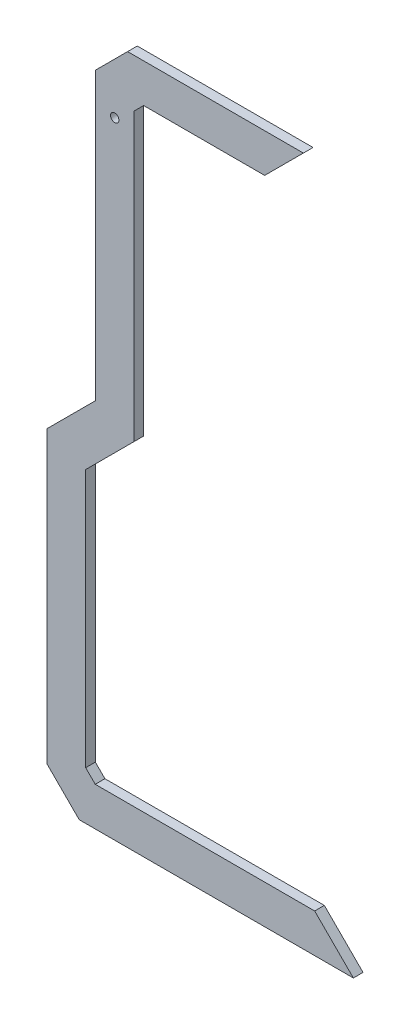
ISO-10303-21;
HEADER;
FILE_DESCRIPTION(('STEP AP214'),'2;1');
FILE_NAME('part.step','',(''),(''),'','','');
FILE_SCHEMA(('AUTOMOTIVE_DESIGN { 1 0 10303 214 1 1 1 1 }'));
ENDSEC;
DATA;
#1=APPLICATION_CONTEXT('core data for automotive mechanical design processes');
#2=APPLICATION_PROTOCOL_DEFINITION('international standard','automotive_design',2000,#1);
#3=PRODUCT_CONTEXT('',#1,'mechanical');
#4=PRODUCT('Part','Part','',(#3));
#5=PRODUCT_RELATED_PRODUCT_CATEGORY('part','',(#4));
#6=PRODUCT_DEFINITION_FORMATION('','',#4);
#7=PRODUCT_DEFINITION_CONTEXT('part definition',#1,'design');
#8=PRODUCT_DEFINITION('design','',#6,#7);
#9=PRODUCT_DEFINITION_SHAPE('','',#8);
#10=(LENGTH_UNIT() NAMED_UNIT(*) SI_UNIT(.MILLI.,.METRE.));
#11=(NAMED_UNIT(*) PLANE_ANGLE_UNIT() SI_UNIT($,.RADIAN.));
#12=(NAMED_UNIT(*) SI_UNIT($,.STERADIAN.) SOLID_ANGLE_UNIT());
#13=UNCERTAINTY_MEASURE_WITH_UNIT(LENGTH_MEASURE(1.E-05),#10,'distance_accuracy_value','');
#14=(GEOMETRIC_REPRESENTATION_CONTEXT(3) GLOBAL_UNCERTAINTY_ASSIGNED_CONTEXT((#13)) GLOBAL_UNIT_ASSIGNED_CONTEXT((#10,
#11,#12)) REPRESENTATION_CONTEXT('',''));
#15=CARTESIAN_POINT('',(0.,0.,0.));
#16=DIRECTION('',(0.,0.,1.));
#17=DIRECTION('',(1.,0.,0.));
#18=AXIS2_PLACEMENT_3D('',#15,#16,#17);
#19=CARTESIAN_POINT('',(0.,0.,3.));
#20=DIRECTION('',(0.,0.,1.));
#21=DIRECTION('',(1.,0.,0.));
#22=AXIS2_PLACEMENT_3D('',#19,#20,#21);
#23=PLANE('',#22);
#24=DIRECTION('',(-0.707106781186551,0.707106781186544,0.));
#25=VECTOR('',#24,1.);
#26=CARTESIAN_POINT('',(58.0000000000498,-167.75395984717,3.));
#27=LINE('',#26,#25);
#28=CARTESIAN_POINT('',(70.00000000005,-179.75395984717,3.));
#29=VERTEX_POINT('',#28);
#30=CARTESIAN_POINT('',(58.0000000000498,-167.75395984717,3.));
#31=VERTEX_POINT('',#30);
#32=EDGE_CURVE('E221',#29,#31,#27,.T.);
#33=ORIENTED_EDGE('',*,*,#32,.T.);
#34=DIRECTION('',(-1.,0.,0.));
#35=VECTOR('',#34,1.);
#36=CARTESIAN_POINT('',(-10.0294372514729,-167.75395984717,3.));
#37=LINE('',#36,#35);
#38=CARTESIAN_POINT('',(-10.0294372514729,-167.75395984717,3.));
#39=VERTEX_POINT('',#38);
#40=EDGE_CURVE('E129',#31,#39,#37,.T.);
#41=ORIENTED_EDGE('',*,*,#40,.T.);
#42=DIRECTION('',(-0.707106781186547,0.707106781186548,0.));
#43=VECTOR('',#42,1.);
#44=CARTESIAN_POINT('',(-12.9999999999501,-164.783397098693,3.));
#45=LINE('',#44,#43);
#46=CARTESIAN_POINT('',(-12.9999999999501,-164.783397098693,3.));
#47=VERTEX_POINT('',#46);
#48=EDGE_CURVE('E260',#39,#47,#45,.T.);
#49=ORIENTED_EDGE('',*,*,#48,.T.);
#50=DIRECTION('',(0.,1.,0.));
#51=VECTOR('',#50,1.);
#52=CARTESIAN_POINT('',(-12.9999999999501,-84.724522595647,3.));
#53=LINE('',#52,#51);
#54=CARTESIAN_POINT('',(-12.9999999999501,-84.724522595647,3.));
#55=VERTEX_POINT('',#54);
#56=EDGE_CURVE('E279',#47,#55,#53,.T.);
#57=ORIENTED_EDGE('',*,*,#56,.T.);
#58=DIRECTION('',(0.707106781186548,0.707106781186547,0.));
#59=VECTOR('',#58,1.);
#60=CARTESIAN_POINT('',(2.00000000004993,-69.724522595647,3.));
#61=LINE('',#60,#59);
#62=CARTESIAN_POINT('',(2.00000000004993,-69.724522595647,3.));
#63=VERTEX_POINT('',#62);
#64=EDGE_CURVE('E276',#55,#63,#61,.T.);
#65=ORIENTED_EDGE('',*,*,#64,.T.);
#66=DIRECTION('',(0.,1.,0.));
#67=VECTOR('',#66,1.);
#68=CARTESIAN_POINT('',(2.0000000000499,19.0329830325361,3.));
#69=LINE('',#68,#67);
#70=CARTESIAN_POINT('',(2.0000000000499,19.0329830325361,3.));
#71=VERTEX_POINT('',#70);
#72=EDGE_CURVE('E278',#63,#71,#69,.T.);
#73=ORIENTED_EDGE('',*,*,#72,.T.);
#74=DIRECTION('',(0.707106781186547,0.707106781186548,0.));
#75=VECTOR('',#74,1.);
#76=CARTESIAN_POINT('',(4.97056274852707,22.0035457810133,3.));
#77=LINE('',#76,#75);
#78=CARTESIAN_POINT('',(4.97056274852707,22.0035457810133,3.));
#79=VERTEX_POINT('',#78);
#80=EDGE_CURVE('E281',#71,#79,#77,.T.);
#81=ORIENTED_EDGE('',*,*,#80,.T.);
#82=DIRECTION('',(1.,0.,0.));
#83=VECTOR('',#82,1.);
#84=CARTESIAN_POINT('',(42.5000000000001,22.0035457810132,3.));
#85=LINE('',#84,#83);
#86=CARTESIAN_POINT('',(42.5000000000001,22.0035457810132,3.));
#87=VERTEX_POINT('',#86);
#88=EDGE_CURVE('E287',#79,#87,#85,.T.);
#89=ORIENTED_EDGE('',*,*,#88,.T.);
#90=DIRECTION('',(0.707106781186546,0.707106781186549,0.));
#91=VECTOR('',#90,1.);
#92=CARTESIAN_POINT('',(54.5000000000001,34.0035457810133,3.));
#93=LINE('',#92,#91);
#94=CARTESIAN_POINT('',(54.5000000000001,34.0035457810133,3.));
#95=VERTEX_POINT('',#94);
#96=EDGE_CURVE('E289',#87,#95,#93,.T.);
#97=ORIENTED_EDGE('',*,*,#96,.T.);
#98=DIRECTION('',(-1.,0.,0.));
#99=VECTOR('',#98,1.);
#100=CARTESIAN_POINT('',(4.99372209757684E-11,34.0035457810133,3.));
#101=LINE('',#100,#99);
#102=CARTESIAN_POINT('',(4.99372209757684E-11,34.0035457810133,3.));
#103=VERTEX_POINT('',#102);
#104=EDGE_CURVE('E291',#95,#103,#101,.T.);
#105=ORIENTED_EDGE('',*,*,#104,.T.);
#106=DIRECTION('',(-0.707106781186548,-0.707106781186548,0.));
#107=VECTOR('',#106,1.);
#108=CARTESIAN_POINT('',(-9.99999999995007,24.0035457810133,3.));
#109=LINE('',#108,#107);
#110=CARTESIAN_POINT('',(-9.99999999995007,24.0035457810133,3.));
#111=VERTEX_POINT('',#110);
#112=EDGE_CURVE('E293',#103,#111,#109,.T.);
#113=ORIENTED_EDGE('',*,*,#112,.T.);
#114=DIRECTION('',(0.,-1.,0.));
#115=VECTOR('',#114,1.);
#116=CARTESIAN_POINT('',(-9.99999999995024,-64.7539598471697,3.));
#117=LINE('',#116,#115);
#118=CARTESIAN_POINT('',(-9.99999999995024,-64.7539598471697,3.));
#119=VERTEX_POINT('',#118);
#120=EDGE_CURVE('E295',#111,#119,#117,.T.);
#121=ORIENTED_EDGE('',*,*,#120,.T.);
#122=DIRECTION('',(-0.70710678118654,-0.707106781186555,0.));
#123=VECTOR('',#122,1.);
#124=CARTESIAN_POINT('',(-24.9999999999501,-79.7539598471698,3.));
#125=LINE('',#124,#123);
#126=CARTESIAN_POINT('',(-24.9999999999501,-79.7539598471698,3.));
#127=VERTEX_POINT('',#126);
#128=EDGE_CURVE('E172',#119,#127,#125,.T.);
#129=ORIENTED_EDGE('',*,*,#128,.T.);
#130=DIRECTION('',(0.,-1.,0.));
#131=VECTOR('',#130,1.);
#132=CARTESIAN_POINT('',(-24.9999999999501,-169.75395984717,3.));
#133=LINE('',#132,#131);
#134=CARTESIAN_POINT('',(-24.9999999999501,-169.75395984717,3.));
#135=VERTEX_POINT('',#134);
#136=EDGE_CURVE('E166',#127,#135,#133,.T.);
#137=ORIENTED_EDGE('',*,*,#136,.T.);
#138=DIRECTION('',(0.707106781186547,-0.707106781186548,0.));
#139=VECTOR('',#138,1.);
#140=CARTESIAN_POINT('',(-14.9999999999501,-179.75395984717,3.));
#141=LINE('',#140,#139);
#142=CARTESIAN_POINT('',(-14.9999999999501,-179.75395984717,3.));
#143=VERTEX_POINT('',#142);
#144=EDGE_CURVE('E170',#135,#143,#141,.T.);
#145=ORIENTED_EDGE('',*,*,#144,.T.);
#146=DIRECTION('',(1.,0.,0.));
#147=VECTOR('',#146,1.);
#148=CARTESIAN_POINT('',(70.00000000005,-179.75395984717,3.));
#149=LINE('',#148,#147);
#150=EDGE_CURVE('E62',#143,#29,#149,.T.);
#151=ORIENTED_EDGE('',*,*,#150,.T.);
#152=EDGE_LOOP('',(#33,#41,#49,#57,#65,#73,#81,#89,#97,#105,#113,#121,#129,#137,#145,#151));
#153=FACE_BOUND('',#152,.T.);
#154=CARTESIAN_POINT('',(-3.99999999995006,14.2435457810134,3.));
#155=DIRECTION('',(0.,0.,1.));
#156=DIRECTION('',(1.,0.,0.));
#157=AXIS2_PLACEMENT_3D('',#154,#155,#156);
#158=CIRCLE('',#157,1.3);
#159=CARTESIAN_POINT('',(-2.69999999995006,14.2435457810134,3.));
#160=VERTEX_POINT('',#159);
#161=EDGE_CURVE('E194',#160,#160,#158,.T.);
#162=ORIENTED_EDGE('',*,*,#161,.F.);
#163=EDGE_LOOP('',(#162));
#164=FACE_BOUND('',#163,.T.);
#165=ADVANCED_FACE('F45',(#153,#164),#23,.T.);
#166=CARTESIAN_POINT('',(0.,0.,0.));
#167=DIRECTION('',(0.,0.,1.));
#168=DIRECTION('',(1.,0.,0.));
#169=AXIS2_PLACEMENT_3D('',#166,#167,#168);
#170=PLANE('',#169);
#171=DIRECTION('',(-0.707106781186551,0.707106781186544,0.));
#172=VECTOR('',#171,1.);
#173=CARTESIAN_POINT('',(58.0000000000498,-167.75395984717,0.));
#174=LINE('',#173,#172);
#175=CARTESIAN_POINT('',(70.00000000005,-179.75395984717,0.));
#176=VERTEX_POINT('',#175);
#177=CARTESIAN_POINT('',(58.0000000000498,-167.75395984717,0.));
#178=VERTEX_POINT('',#177);
#179=EDGE_CURVE('E190',#176,#178,#174,.T.);
#180=ORIENTED_EDGE('',*,*,#179,.F.);
#181=DIRECTION('',(1.,0.,0.));
#182=VECTOR('',#181,1.);
#183=CARTESIAN_POINT('',(70.00000000005,-179.75395984717,0.));
#184=LINE('',#183,#182);
#185=CARTESIAN_POINT('',(-14.9999999999501,-179.75395984717,0.));
#186=VERTEX_POINT('',#185);
#187=EDGE_CURVE('E121',#186,#176,#184,.T.);
#188=ORIENTED_EDGE('',*,*,#187,.F.);
#189=DIRECTION('',(0.707106781186547,-0.707106781186548,0.));
#190=VECTOR('',#189,1.);
#191=CARTESIAN_POINT('',(-14.9999999999501,-179.75395984717,0.));
#192=LINE('',#191,#190);
#193=CARTESIAN_POINT('',(-24.9999999999501,-169.75395984717,0.));
#194=VERTEX_POINT('',#193);
#195=EDGE_CURVE('E115',#194,#186,#192,.T.);
#196=ORIENTED_EDGE('',*,*,#195,.F.);
#197=DIRECTION('',(0.,-1.,0.));
#198=VECTOR('',#197,1.);
#199=CARTESIAN_POINT('',(-24.9999999999501,-169.75395984717,0.));
#200=LINE('',#199,#198);
#201=CARTESIAN_POINT('',(-24.9999999999501,-79.7539598471698,0.));
#202=VERTEX_POINT('',#201);
#203=EDGE_CURVE('E180',#202,#194,#200,.T.);
#204=ORIENTED_EDGE('',*,*,#203,.F.);
#205=DIRECTION('',(-0.70710678118654,-0.707106781186555,0.));
#206=VECTOR('',#205,1.);
#207=CARTESIAN_POINT('',(-24.9999999999501,-79.7539598471698,0.));
#208=LINE('',#207,#206);
#209=CARTESIAN_POINT('',(-9.99999999995024,-64.7539598471697,0.));
#210=VERTEX_POINT('',#209);
#211=EDGE_CURVE('E216',#210,#202,#208,.T.);
#212=ORIENTED_EDGE('',*,*,#211,.F.);
#213=DIRECTION('',(0.,-1.,0.));
#214=VECTOR('',#213,1.);
#215=CARTESIAN_POINT('',(-9.99999999995024,-64.7539598471697,0.));
#216=LINE('',#215,#214);
#217=CARTESIAN_POINT('',(-9.99999999995007,24.0035457810133,0.));
#218=VERTEX_POINT('',#217);
#219=EDGE_CURVE('E214',#218,#210,#216,.T.);
#220=ORIENTED_EDGE('',*,*,#219,.F.);
#221=DIRECTION('',(-0.707106781186548,-0.707106781186548,0.));
#222=VECTOR('',#221,1.);
#223=CARTESIAN_POINT('',(-9.99999999995007,24.0035457810133,0.));
#224=LINE('',#223,#222);
#225=CARTESIAN_POINT('',(4.99372209757684E-11,34.0035457810133,0.));
#226=VERTEX_POINT('',#225);
#227=EDGE_CURVE('E212',#226,#218,#224,.T.);
#228=ORIENTED_EDGE('',*,*,#227,.F.);
#229=DIRECTION('',(-1.,0.,0.));
#230=VECTOR('',#229,1.);
#231=CARTESIAN_POINT('',(4.99372209757684E-11,34.0035457810133,0.));
#232=LINE('',#231,#230);
#233=CARTESIAN_POINT('',(54.5000000000001,34.0035457810133,0.));
#234=VERTEX_POINT('',#233);
#235=EDGE_CURVE('E210',#234,#226,#232,.T.);
#236=ORIENTED_EDGE('',*,*,#235,.F.);
#237=DIRECTION('',(0.707106781186546,0.707106781186549,0.));
#238=VECTOR('',#237,1.);
#239=CARTESIAN_POINT('',(54.5000000000001,34.0035457810133,0.));
#240=LINE('',#239,#238);
#241=CARTESIAN_POINT('',(42.5000000000001,22.0035457810132,0.));
#242=VERTEX_POINT('',#241);
#243=EDGE_CURVE('E208',#242,#234,#240,.T.);
#244=ORIENTED_EDGE('',*,*,#243,.F.);
#245=DIRECTION('',(1.,0.,0.));
#246=VECTOR('',#245,1.);
#247=CARTESIAN_POINT('',(42.5000000000001,22.0035457810132,0.));
#248=LINE('',#247,#246);
#249=CARTESIAN_POINT('',(4.97056274852707,22.0035457810133,0.));
#250=VERTEX_POINT('',#249);
#251=EDGE_CURVE('E206',#250,#242,#248,.T.);
#252=ORIENTED_EDGE('',*,*,#251,.F.);
#253=DIRECTION('',(0.707106781186547,0.707106781186548,0.));
#254=VECTOR('',#253,1.);
#255=CARTESIAN_POINT('',(4.97056274852707,22.0035457810133,0.));
#256=LINE('',#255,#254);
#257=CARTESIAN_POINT('',(2.0000000000499,19.0329830325361,0.));
#258=VERTEX_POINT('',#257);
#259=EDGE_CURVE('E204',#258,#250,#256,.T.);
#260=ORIENTED_EDGE('',*,*,#259,.F.);
#261=DIRECTION('',(0.,1.,0.));
#262=VECTOR('',#261,1.);
#263=CARTESIAN_POINT('',(2.0000000000499,19.0329830325361,0.));
#264=LINE('',#263,#262);
#265=CARTESIAN_POINT('',(2.00000000004993,-69.724522595647,0.));
#266=VERTEX_POINT('',#265);
#267=EDGE_CURVE('E202',#266,#258,#264,.T.);
#268=ORIENTED_EDGE('',*,*,#267,.F.);
#269=DIRECTION('',(0.707106781186548,0.707106781186547,0.));
#270=VECTOR('',#269,1.);
#271=CARTESIAN_POINT('',(2.00000000004993,-69.724522595647,0.));
#272=LINE('',#271,#270);
#273=CARTESIAN_POINT('',(-12.9999999999501,-84.724522595647,0.));
#274=VERTEX_POINT('',#273);
#275=EDGE_CURVE('E200',#274,#266,#272,.T.);
#276=ORIENTED_EDGE('',*,*,#275,.F.);
#277=DIRECTION('',(0.,1.,0.));
#278=VECTOR('',#277,1.);
#279=CARTESIAN_POINT('',(-12.9999999999501,-84.724522595647,0.));
#280=LINE('',#279,#278);
#281=CARTESIAN_POINT('',(-12.9999999999501,-164.783397098693,0.));
#282=VERTEX_POINT('',#281);
#283=EDGE_CURVE('E198',#282,#274,#280,.T.);
#284=ORIENTED_EDGE('',*,*,#283,.F.);
#285=DIRECTION('',(-0.707106781186547,0.707106781186548,0.));
#286=VECTOR('',#285,1.);
#287=CARTESIAN_POINT('',(-12.9999999999501,-164.783397098693,0.));
#288=LINE('',#287,#286);
#289=CARTESIAN_POINT('',(-10.0294372514729,-167.75395984717,0.));
#290=VERTEX_POINT('',#289);
#291=EDGE_CURVE('E196',#290,#282,#288,.T.);
#292=ORIENTED_EDGE('',*,*,#291,.F.);
#293=DIRECTION('',(-1.,0.,0.));
#294=VECTOR('',#293,1.);
#295=CARTESIAN_POINT('',(-10.0294372514729,-167.75395984717,0.));
#296=LINE('',#295,#294);
#297=EDGE_CURVE('E193',#178,#290,#296,.T.);
#298=ORIENTED_EDGE('',*,*,#297,.F.);
#299=EDGE_LOOP('',(#180,#188,#196,#204,#212,#220,#228,#236,#244,#252,#260,#268,#276,#284,#292,#298));
#300=FACE_BOUND('',#299,.T.);
#301=CARTESIAN_POINT('',(-3.99999999995006,14.2435457810134,0.));
#302=DIRECTION('',(0.,0.,1.));
#303=DIRECTION('',(1.,0.,0.));
#304=AXIS2_PLACEMENT_3D('',#301,#302,#303);
#305=CIRCLE('',#304,1.3);
#306=CARTESIAN_POINT('',(-2.69999999995006,14.2435457810134,0.));
#307=VERTEX_POINT('',#306);
#308=EDGE_CURVE('E494',#307,#307,#305,.T.);
#309=ORIENTED_EDGE('',*,*,#308,.T.);
#310=EDGE_LOOP('',(#309));
#311=FACE_BOUND('',#310,.T.);
#312=ADVANCED_FACE('F264',(#300,#311),#170,.F.);
#313=CARTESIAN_POINT('',(58.0000000000498,-167.75395984717,3.));
#314=DIRECTION('',(-0.707106781186544,-0.707106781186551,0.));
#315=DIRECTION('',(0.707106781186551,-0.707106781186544,0.));
#316=AXIS2_PLACEMENT_3D('',#313,#314,#315);
#317=PLANE('',#316);
#318=ORIENTED_EDGE('',*,*,#179,.T.);
#319=DIRECTION('',(0.,0.,-1.));
#320=VECTOR('',#319,1.);
#321=CARTESIAN_POINT('',(58.0000000000498,-167.75395984717,3.));
#322=LINE('',#321,#320);
#323=EDGE_CURVE('E13',#31,#178,#322,.T.);
#324=ORIENTED_EDGE('',*,*,#323,.F.);
#325=ORIENTED_EDGE('',*,*,#32,.F.);
#326=DIRECTION('',(0.,0.,-1.));
#327=VECTOR('',#326,1.);
#328=CARTESIAN_POINT('',(70.00000000005,-179.75395984717,3.));
#329=LINE('',#328,#327);
#330=EDGE_CURVE('E186',#29,#176,#329,.T.);
#331=ORIENTED_EDGE('',*,*,#330,.T.);
#332=EDGE_LOOP('',(#318,#324,#325,#331));
#333=FACE_BOUND('',#332,.T.);
#334=ADVANCED_FACE('F47',(#333),#317,.F.);
#335=CARTESIAN_POINT('',(-10.0294372514729,-167.75395984717,3.));
#336=DIRECTION('',(0.,-1.,0.));
#337=DIRECTION('',(0.,0.,-1.));
#338=AXIS2_PLACEMENT_3D('',#335,#336,#337);
#339=PLANE('',#338);
#340=ORIENTED_EDGE('',*,*,#297,.T.);
#341=DIRECTION('',(0.,0.,-1.));
#342=VECTOR('',#341,1.);
#343=CARTESIAN_POINT('',(-10.0294372514729,-167.75395984717,3.));
#344=LINE('',#343,#342);
#345=EDGE_CURVE('E54',#39,#290,#344,.T.);
#346=ORIENTED_EDGE('',*,*,#345,.F.);
#347=ORIENTED_EDGE('',*,*,#40,.F.);
#348=ORIENTED_EDGE('',*,*,#323,.T.);
#349=EDGE_LOOP('',(#340,#346,#347,#348));
#350=FACE_BOUND('',#349,.T.);
#351=ADVANCED_FACE('F329',(#350),#339,.F.);
#352=CARTESIAN_POINT('',(-12.9999999999501,-164.783397098693,3.));
#353=DIRECTION('',(-0.707106781186548,-0.707106781186547,0.));
#354=DIRECTION('',(0.707106781186547,-0.707106781186548,0.));
#355=AXIS2_PLACEMENT_3D('',#352,#353,#354);
#356=PLANE('',#355);
#357=ORIENTED_EDGE('',*,*,#291,.T.);
#358=DIRECTION('',(0.,0.,-1.));
#359=VECTOR('',#358,1.);
#360=CARTESIAN_POINT('',(-12.9999999999501,-164.783397098693,3.));
#361=LINE('',#360,#359);
#362=EDGE_CURVE('E252',#47,#282,#361,.T.);
#363=ORIENTED_EDGE('',*,*,#362,.F.);
#364=ORIENTED_EDGE('',*,*,#48,.F.);
#365=ORIENTED_EDGE('',*,*,#345,.T.);
#366=EDGE_LOOP('',(#357,#363,#364,#365));
#367=FACE_BOUND('',#366,.T.);
#368=ADVANCED_FACE('F258',(#367),#356,.F.);
#369=CARTESIAN_POINT('',(-12.9999999999501,-84.724522595647,3.));
#370=DIRECTION('',(-1.,0.,0.));
#371=DIRECTION('',(0.,-1.,0.));
#372=AXIS2_PLACEMENT_3D('',#369,#370,#371);
#373=PLANE('',#372);
#374=ORIENTED_EDGE('',*,*,#283,.T.);
#375=DIRECTION('',(0.,0.,-1.));
#376=VECTOR('',#375,1.);
#377=CARTESIAN_POINT('',(-12.9999999999501,-84.724522595647,3.));
#378=LINE('',#377,#376);
#379=EDGE_CURVE('E249',#55,#274,#378,.T.);
#380=ORIENTED_EDGE('',*,*,#379,.F.);
#381=ORIENTED_EDGE('',*,*,#56,.F.);
#382=ORIENTED_EDGE('',*,*,#362,.T.);
#383=EDGE_LOOP('',(#374,#380,#381,#382));
#384=FACE_BOUND('',#383,.T.);
#385=ADVANCED_FACE('F270',(#384),#373,.F.);
#386=CARTESIAN_POINT('',(2.00000000004993,-69.724522595647,3.));
#387=DIRECTION('',(-0.707106781186547,0.707106781186548,0.));
#388=DIRECTION('',(-0.707106781186548,-0.707106781186547,0.));
#389=AXIS2_PLACEMENT_3D('',#386,#387,#388);
#390=PLANE('',#389);
#391=ORIENTED_EDGE('',*,*,#275,.T.);
#392=DIRECTION('',(0.,0.,-1.));
#393=VECTOR('',#392,1.);
#394=CARTESIAN_POINT('',(2.00000000004993,-69.724522595647,3.));
#395=LINE('',#394,#393);
#396=EDGE_CURVE('E246',#63,#266,#395,.T.);
#397=ORIENTED_EDGE('',*,*,#396,.F.);
#398=ORIENTED_EDGE('',*,*,#64,.F.);
#399=ORIENTED_EDGE('',*,*,#379,.T.);
#400=EDGE_LOOP('',(#391,#397,#398,#399));
#401=FACE_BOUND('',#400,.T.);
#402=ADVANCED_FACE('F274',(#401),#390,.F.);
#403=CARTESIAN_POINT('',(2.0000000000499,19.0329830325361,3.));
#404=DIRECTION('',(-1.,0.,0.));
#405=DIRECTION('',(0.,-1.,0.));
#406=AXIS2_PLACEMENT_3D('',#403,#404,#405);
#407=PLANE('',#406);
#408=ORIENTED_EDGE('',*,*,#267,.T.);
#409=DIRECTION('',(0.,0.,-1.));
#410=VECTOR('',#409,1.);
#411=CARTESIAN_POINT('',(2.0000000000499,19.0329830325361,3.));
#412=LINE('',#411,#410);
#413=EDGE_CURVE('E243',#71,#258,#412,.T.);
#414=ORIENTED_EDGE('',*,*,#413,.F.);
#415=ORIENTED_EDGE('',*,*,#72,.F.);
#416=ORIENTED_EDGE('',*,*,#396,.T.);
#417=EDGE_LOOP('',(#408,#414,#415,#416));
#418=FACE_BOUND('',#417,.T.);
#419=ADVANCED_FACE('F342',(#418),#407,.F.);
#420=CARTESIAN_POINT('',(4.97056274852707,22.0035457810133,3.));
#421=DIRECTION('',(-0.707106781186548,0.707106781186547,0.));
#422=DIRECTION('',(-0.707106781186547,-0.707106781186548,0.));
#423=AXIS2_PLACEMENT_3D('',#420,#421,#422);
#424=PLANE('',#423);
#425=ORIENTED_EDGE('',*,*,#259,.T.);
#426=DIRECTION('',(0.,0.,-1.));
#427=VECTOR('',#426,1.);
#428=CARTESIAN_POINT('',(4.97056274852707,22.0035457810133,3.));
#429=LINE('',#428,#427);
#430=EDGE_CURVE('E240',#79,#250,#429,.T.);
#431=ORIENTED_EDGE('',*,*,#430,.F.);
#432=ORIENTED_EDGE('',*,*,#80,.F.);
#433=ORIENTED_EDGE('',*,*,#413,.T.);
#434=EDGE_LOOP('',(#425,#431,#432,#433));
#435=FACE_BOUND('',#434,.T.);
#436=ADVANCED_FACE('F345',(#435),#424,.F.);
#437=CARTESIAN_POINT('',(42.5000000000001,22.0035457810132,3.));
#438=DIRECTION('',(0.,1.,0.));
#439=DIRECTION('',(-1.,0.,0.));
#440=AXIS2_PLACEMENT_3D('',#437,#438,#439);
#441=PLANE('',#440);
#442=ORIENTED_EDGE('',*,*,#251,.T.);
#443=DIRECTION('',(0.,0.,-1.));
#444=VECTOR('',#443,1.);
#445=CARTESIAN_POINT('',(42.5000000000001,22.0035457810132,3.));
#446=LINE('',#445,#444);
#447=EDGE_CURVE('E237',#87,#242,#446,.T.);
#448=ORIENTED_EDGE('',*,*,#447,.F.);
#449=ORIENTED_EDGE('',*,*,#88,.F.);
#450=ORIENTED_EDGE('',*,*,#430,.T.);
#451=EDGE_LOOP('',(#442,#448,#449,#450));
#452=FACE_BOUND('',#451,.T.);
#453=ADVANCED_FACE('F349',(#452),#441,.F.);
#454=CARTESIAN_POINT('',(54.5000000000001,34.0035457810133,3.));
#455=DIRECTION('',(-0.707106781186549,0.707106781186546,0.));
#456=DIRECTION('',(-0.707106781186546,-0.707106781186549,0.));
#457=AXIS2_PLACEMENT_3D('',#454,#455,#456);
#458=PLANE('',#457);
#459=ORIENTED_EDGE('',*,*,#243,.T.);
#460=DIRECTION('',(0.,0.,-1.));
#461=VECTOR('',#460,1.);
#462=CARTESIAN_POINT('',(54.5000000000001,34.0035457810133,3.));
#463=LINE('',#462,#461);
#464=EDGE_CURVE('E234',#95,#234,#463,.T.);
#465=ORIENTED_EDGE('',*,*,#464,.F.);
#466=ORIENTED_EDGE('',*,*,#96,.F.);
#467=ORIENTED_EDGE('',*,*,#447,.T.);
#468=EDGE_LOOP('',(#459,#465,#466,#467));
#469=FACE_BOUND('',#468,.T.);
#470=ADVANCED_FACE('F353',(#469),#458,.F.);
#471=CARTESIAN_POINT('',(4.99372209757684E-11,34.0035457810133,3.));
#472=DIRECTION('',(0.,-1.,0.));
#473=DIRECTION('',(0.,0.,-1.));
#474=AXIS2_PLACEMENT_3D('',#471,#472,#473);
#475=PLANE('',#474);
#476=ORIENTED_EDGE('',*,*,#235,.T.);
#477=DIRECTION('',(0.,0.,-1.));
#478=VECTOR('',#477,1.);
#479=CARTESIAN_POINT('',(4.99372209757684E-11,34.0035457810133,3.));
#480=LINE('',#479,#478);
#481=EDGE_CURVE('E231',#103,#226,#480,.T.);
#482=ORIENTED_EDGE('',*,*,#481,.F.);
#483=ORIENTED_EDGE('',*,*,#104,.F.);
#484=ORIENTED_EDGE('',*,*,#464,.T.);
#485=EDGE_LOOP('',(#476,#482,#483,#484));
#486=FACE_BOUND('',#485,.T.);
#487=ADVANCED_FACE('F357',(#486),#475,.F.);
#488=CARTESIAN_POINT('',(-9.99999999995007,24.0035457810133,3.));
#489=DIRECTION('',(0.707106781186547,-0.707106781186548,0.));
#490=DIRECTION('',(0.707106781186548,0.707106781186547,0.));
#491=AXIS2_PLACEMENT_3D('',#488,#489,#490);
#492=PLANE('',#491);
#493=ORIENTED_EDGE('',*,*,#227,.T.);
#494=DIRECTION('',(0.,0.,-1.));
#495=VECTOR('',#494,1.);
#496=CARTESIAN_POINT('',(-9.99999999995007,24.0035457810133,3.));
#497=LINE('',#496,#495);
#498=EDGE_CURVE('E228',#111,#218,#497,.T.);
#499=ORIENTED_EDGE('',*,*,#498,.F.);
#500=ORIENTED_EDGE('',*,*,#112,.F.);
#501=ORIENTED_EDGE('',*,*,#481,.T.);
#502=EDGE_LOOP('',(#493,#499,#500,#501));
#503=FACE_BOUND('',#502,.T.);
#504=ADVANCED_FACE('F361',(#503),#492,.F.);
#505=CARTESIAN_POINT('',(-9.99999999995024,-64.7539598471697,3.));
#506=DIRECTION('',(1.,0.,0.));
#507=DIRECTION('',(0.,1.,0.));
#508=AXIS2_PLACEMENT_3D('',#505,#506,#507);
#509=PLANE('',#508);
#510=ORIENTED_EDGE('',*,*,#219,.T.);
#511=DIRECTION('',(0.,0.,-1.));
#512=VECTOR('',#511,1.);
#513=CARTESIAN_POINT('',(-9.99999999995024,-64.7539598471697,3.));
#514=LINE('',#513,#512);
#515=EDGE_CURVE('E225',#119,#210,#514,.T.);
#516=ORIENTED_EDGE('',*,*,#515,.F.);
#517=ORIENTED_EDGE('',*,*,#120,.F.);
#518=ORIENTED_EDGE('',*,*,#498,.T.);
#519=EDGE_LOOP('',(#510,#516,#517,#518));
#520=FACE_BOUND('',#519,.T.);
#521=ADVANCED_FACE('F301',(#520),#509,.F.);
#522=CARTESIAN_POINT('',(-24.9999999999501,-79.7539598471698,3.));
#523=DIRECTION('',(0.707106781186555,-0.70710678118654,0.));
#524=DIRECTION('',(0.70710678118654,0.707106781186555,0.));
#525=AXIS2_PLACEMENT_3D('',#522,#523,#524);
#526=PLANE('',#525);
#527=ORIENTED_EDGE('',*,*,#211,.T.);
#528=DIRECTION('',(0.,0.,-1.));
#529=VECTOR('',#528,1.);
#530=CARTESIAN_POINT('',(-24.9999999999501,-79.7539598471698,3.));
#531=LINE('',#530,#529);
#532=EDGE_CURVE('E181',#127,#202,#531,.T.);
#533=ORIENTED_EDGE('',*,*,#532,.F.);
#534=ORIENTED_EDGE('',*,*,#128,.F.);
#535=ORIENTED_EDGE('',*,*,#515,.T.);
#536=EDGE_LOOP('',(#527,#533,#534,#535));
#537=FACE_BOUND('',#536,.T.);
#538=ADVANCED_FACE('F305',(#537),#526,.F.);
#539=CARTESIAN_POINT('',(-24.9999999999501,-169.75395984717,3.));
#540=DIRECTION('',(1.,0.,0.));
#541=DIRECTION('',(0.,1.,0.));
#542=AXIS2_PLACEMENT_3D('',#539,#540,#541);
#543=PLANE('',#542);
#544=ORIENTED_EDGE('',*,*,#203,.T.);
#545=DIRECTION('',(0.,0.,-1.));
#546=VECTOR('',#545,1.);
#547=CARTESIAN_POINT('',(-24.9999999999501,-169.75395984717,3.));
#548=LINE('',#547,#546);
#549=EDGE_CURVE('E177',#135,#194,#548,.T.);
#550=ORIENTED_EDGE('',*,*,#549,.F.);
#551=ORIENTED_EDGE('',*,*,#136,.F.);
#552=ORIENTED_EDGE('',*,*,#532,.T.);
#553=EDGE_LOOP('',(#544,#550,#551,#552));
#554=FACE_BOUND('',#553,.T.);
#555=ADVANCED_FACE('F178',(#554),#543,.F.);
#556=CARTESIAN_POINT('',(-14.9999999999501,-179.75395984717,3.));
#557=DIRECTION('',(0.707106781186548,0.707106781186547,0.));
#558=DIRECTION('',(-0.707106781186547,0.707106781186548,0.));
#559=AXIS2_PLACEMENT_3D('',#556,#557,#558);
#560=PLANE('',#559);
#561=ORIENTED_EDGE('',*,*,#195,.T.);
#562=DIRECTION('',(0.,0.,-1.));
#563=VECTOR('',#562,1.);
#564=CARTESIAN_POINT('',(-14.9999999999501,-179.75395984717,3.));
#565=LINE('',#564,#563);
#566=EDGE_CURVE('E182',#143,#186,#565,.T.);
#567=ORIENTED_EDGE('',*,*,#566,.F.);
#568=ORIENTED_EDGE('',*,*,#144,.F.);
#569=ORIENTED_EDGE('',*,*,#549,.T.);
#570=EDGE_LOOP('',(#561,#567,#568,#569));
#571=FACE_BOUND('',#570,.T.);
#572=ADVANCED_FACE('F184',(#571),#560,.F.);
#573=CARTESIAN_POINT('',(70.00000000005,-179.75395984717,3.));
#574=DIRECTION('',(0.,1.,0.));
#575=DIRECTION('',(0.,0.,1.));
#576=AXIS2_PLACEMENT_3D('',#573,#574,#575);
#577=PLANE('',#576);
#578=ORIENTED_EDGE('',*,*,#187,.T.);
#579=ORIENTED_EDGE('',*,*,#330,.F.);
#580=ORIENTED_EDGE('',*,*,#150,.F.);
#581=ORIENTED_EDGE('',*,*,#566,.T.);
#582=EDGE_LOOP('',(#578,#579,#580,#581));
#583=FACE_BOUND('',#582,.T.);
#584=ADVANCED_FACE('F309',(#583),#577,.F.);
#585=CARTESIAN_POINT('',(-3.99999999995006,14.2435457810134,3.));
#586=DIRECTION('',(0.,0.,-1.));
#587=DIRECTION('',(-1.,0.,0.));
#588=AXIS2_PLACEMENT_3D('',#585,#586,#587);
#589=CYLINDRICAL_SURFACE('',#588,1.3);
#590=ORIENTED_EDGE('',*,*,#161,.T.);
#591=EDGE_LOOP('',(#590));
#592=FACE_BOUND('',#591,.T.);
#593=ORIENTED_EDGE('',*,*,#308,.F.);
#594=EDGE_LOOP('',(#593));
#595=FACE_BOUND('',#594,.T.);
#596=ADVANCED_FACE('F311',(#592,#595),#589,.F.);
#597=CLOSED_SHELL('',(#165,#312,#334,#351,#368,#385,#402,#419,#436,#453,#470,#487,#504,#521,
#538,#555,#572,#584,#596));
#598=MANIFOLD_SOLID_BREP('B2',#597);
#599=ADVANCED_BREP_SHAPE_REPRESENTATION('',(#18,#598),#14);
#600=SHAPE_DEFINITION_REPRESENTATION(#9,#599);
ENDSEC;
END-ISO-10303-21;
